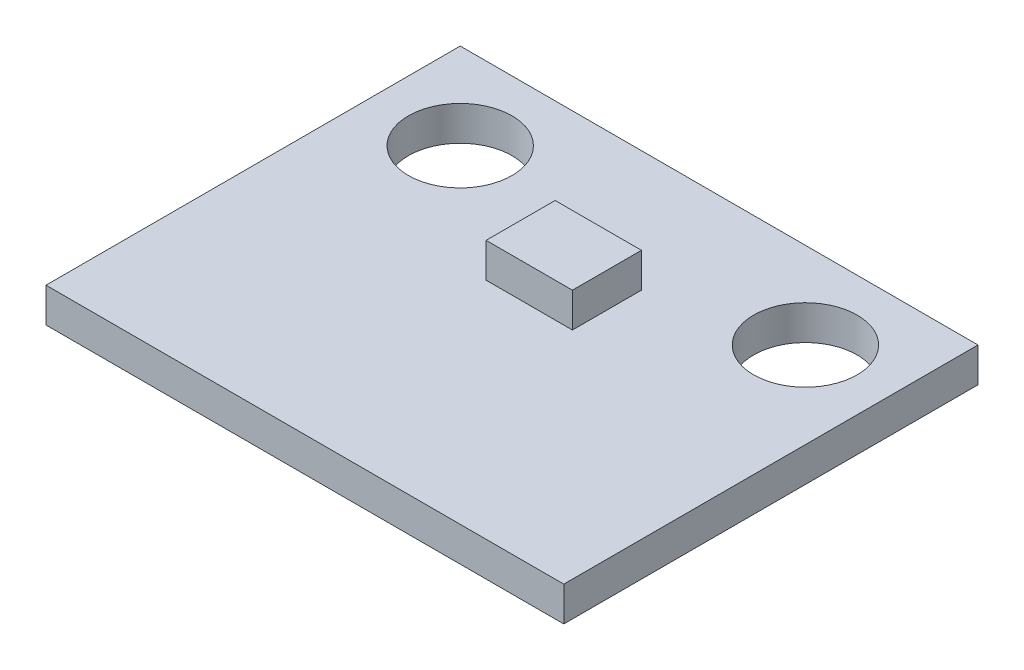
ISO-10303-21;
HEADER;
FILE_DESCRIPTION(('STEP AP214'),'2;1');
FILE_NAME('part.step','',(''),(''),'','','');
FILE_SCHEMA(('AUTOMOTIVE_DESIGN { 1 0 10303 214 1 1 1 1 }'));
ENDSEC;
DATA;
#1=APPLICATION_CONTEXT('core data for automotive mechanical design processes');
#2=APPLICATION_PROTOCOL_DEFINITION('international standard','automotive_design',2000,#1);
#3=PRODUCT_CONTEXT('',#1,'mechanical');
#4=PRODUCT('Part','Part','',(#3));
#5=PRODUCT_RELATED_PRODUCT_CATEGORY('part','',(#4));
#6=PRODUCT_DEFINITION_FORMATION('','',#4);
#7=PRODUCT_DEFINITION_CONTEXT('part definition',#1,'design');
#8=PRODUCT_DEFINITION('design','',#6,#7);
#9=PRODUCT_DEFINITION_SHAPE('','',#8);
#10=(LENGTH_UNIT() NAMED_UNIT(*) SI_UNIT(.MILLI.,.METRE.));
#11=(NAMED_UNIT(*) PLANE_ANGLE_UNIT() SI_UNIT($,.RADIAN.));
#12=(NAMED_UNIT(*) SI_UNIT($,.STERADIAN.) SOLID_ANGLE_UNIT());
#13=UNCERTAINTY_MEASURE_WITH_UNIT(LENGTH_MEASURE(1.E-05),#10,'distance_accuracy_value','');
#14=(GEOMETRIC_REPRESENTATION_CONTEXT(3) GLOBAL_UNCERTAINTY_ASSIGNED_CONTEXT((#13)) GLOBAL_UNIT_ASSIGNED_CONTEXT((#10,
#11,#12)) REPRESENTATION_CONTEXT('',''));
#15=CARTESIAN_POINT('',(0.,0.,0.));
#16=DIRECTION('',(0.,0.,1.));
#17=DIRECTION('',(1.,0.,0.));
#18=AXIS2_PLACEMENT_3D('',#15,#16,#17);
#19=CARTESIAN_POINT('',(0.,1.,0.));
#20=DIRECTION('',(0.,1.,0.));
#21=DIRECTION('',(0.,0.,1.));
#22=AXIS2_PLACEMENT_3D('',#19,#20,#21);
#23=PLANE('',#22);
#24=CARTESIAN_POINT('',(-5.,1.,-3.5));
#25=DIRECTION('',(0.,1.,0.));
#26=DIRECTION('',(0.,0.,1.));
#27=AXIS2_PLACEMENT_3D('',#24,#25,#26);
#28=CIRCLE('',#27,1.5);
#29=CARTESIAN_POINT('',(-5.,1.,-2.));
#30=VERTEX_POINT('',#29);
#31=EDGE_CURVE('E143',#30,#30,#28,.T.);
#32=ORIENTED_EDGE('',*,*,#31,.F.);
#33=EDGE_LOOP('',(#32));
#34=FACE_BOUND('',#33,.T.);
#35=DIRECTION('',(0.,0.,-1.));
#36=VECTOR('',#35,1.);
#37=CARTESIAN_POINT('',(7.5,1.,-6.));
#38=LINE('',#37,#36);
#39=CARTESIAN_POINT('',(7.5,1.,6.));
#40=VERTEX_POINT('',#39);
#41=CARTESIAN_POINT('',(7.5,1.,-6.));
#42=VERTEX_POINT('',#41);
#43=EDGE_CURVE('E149',#40,#42,#38,.T.);
#44=ORIENTED_EDGE('',*,*,#43,.T.);
#45=DIRECTION('',(-1.,0.,0.));
#46=VECTOR('',#45,1.);
#47=CARTESIAN_POINT('',(-7.5,1.,-6.));
#48=LINE('',#47,#46);
#49=CARTESIAN_POINT('',(-7.5,1.,-6.));
#50=VERTEX_POINT('',#49);
#51=EDGE_CURVE('E85',#42,#50,#48,.T.);
#52=ORIENTED_EDGE('',*,*,#51,.T.);
#53=DIRECTION('',(0.,0.,1.));
#54=VECTOR('',#53,1.);
#55=CARTESIAN_POINT('',(-7.5,1.,-6.));
#56=LINE('',#55,#54);
#57=CARTESIAN_POINT('',(-7.5,1.,6.));
#58=VERTEX_POINT('',#57);
#59=EDGE_CURVE('E152',#50,#58,#56,.T.);
#60=ORIENTED_EDGE('',*,*,#59,.T.);
#61=DIRECTION('',(1.,0.,0.));
#62=VECTOR('',#61,1.);
#63=CARTESIAN_POINT('',(-7.5,1.,6.));
#64=LINE('',#63,#62);
#65=EDGE_CURVE('E57',#58,#40,#64,.T.);
#66=ORIENTED_EDGE('',*,*,#65,.T.);
#67=EDGE_LOOP('',(#44,#52,#60,#66));
#68=FACE_BOUND('',#67,.T.);
#69=CARTESIAN_POINT('',(5.,1.,-3.5));
#70=DIRECTION('',(0.,1.,0.));
#71=DIRECTION('',(0.,0.,1.));
#72=AXIS2_PLACEMENT_3D('',#69,#70,#71);
#73=CIRCLE('',#72,1.5);
#74=CARTESIAN_POINT('',(5.,1.,-2.));
#75=VERTEX_POINT('',#74);
#76=EDGE_CURVE('E135',#75,#75,#73,.T.);
#77=ORIENTED_EDGE('',*,*,#76,.F.);
#78=EDGE_LOOP('',(#77));
#79=FACE_BOUND('',#78,.T.);
#80=DIRECTION('',(-1.,0.,0.));
#81=VECTOR('',#80,1.);
#82=CARTESIAN_POINT('',(-1.25,1.,-2.5));
#83=LINE('',#82,#81);
#84=CARTESIAN_POINT('',(1.25,1.,-2.5));
#85=VERTEX_POINT('',#84);
#86=CARTESIAN_POINT('',(-1.25,1.,-2.5));
#87=VERTEX_POINT('',#86);
#88=EDGE_CURVE('E298',#85,#87,#83,.T.);
#89=ORIENTED_EDGE('',*,*,#88,.F.);
#90=DIRECTION('',(0.,0.,-1.));
#91=VECTOR('',#90,1.);
#92=CARTESIAN_POINT('',(1.25,1.,-2.5));
#93=LINE('',#92,#91);
#94=CARTESIAN_POINT('',(1.25,1.,-0.5));
#95=VERTEX_POINT('',#94);
#96=EDGE_CURVE('E130',#95,#85,#93,.T.);
#97=ORIENTED_EDGE('',*,*,#96,.F.);
#98=DIRECTION('',(1.,0.,0.));
#99=VECTOR('',#98,1.);
#100=CARTESIAN_POINT('',(-1.25,1.,-0.5));
#101=LINE('',#100,#99);
#102=CARTESIAN_POINT('',(-1.25,1.,-0.5));
#103=VERTEX_POINT('',#102);
#104=EDGE_CURVE('E126',#103,#95,#101,.T.);
#105=ORIENTED_EDGE('',*,*,#104,.F.);
#106=DIRECTION('',(0.,0.,1.));
#107=VECTOR('',#106,1.);
#108=CARTESIAN_POINT('',(-1.25,1.,-2.5));
#109=LINE('',#108,#107);
#110=EDGE_CURVE('E295',#87,#103,#109,.T.);
#111=ORIENTED_EDGE('',*,*,#110,.F.);
#112=EDGE_LOOP('',(#89,#97,#105,#111));
#113=FACE_BOUND('',#112,.T.);
#114=ADVANCED_FACE('F33',(#34,#68,#79,#113),#23,.T.);
#115=CARTESIAN_POINT('',(0.,0.,0.));
#116=DIRECTION('',(0.,1.,0.));
#117=DIRECTION('',(0.,0.,1.));
#118=AXIS2_PLACEMENT_3D('',#115,#116,#117);
#119=PLANE('',#118);
#120=DIRECTION('',(0.,0.,-1.));
#121=VECTOR('',#120,1.);
#122=CARTESIAN_POINT('',(7.5,0.,-6.));
#123=LINE('',#122,#121);
#124=CARTESIAN_POINT('',(7.5,0.,6.));
#125=VERTEX_POINT('',#124);
#126=CARTESIAN_POINT('',(7.5,0.,-6.));
#127=VERTEX_POINT('',#126);
#128=EDGE_CURVE('E146',#125,#127,#123,.T.);
#129=ORIENTED_EDGE('',*,*,#128,.F.);
#130=DIRECTION('',(1.,0.,0.));
#131=VECTOR('',#130,1.);
#132=CARTESIAN_POINT('',(-7.5,0.,6.));
#133=LINE('',#132,#131);
#134=CARTESIAN_POINT('',(-7.5,0.,6.));
#135=VERTEX_POINT('',#134);
#136=EDGE_CURVE('E78',#135,#125,#133,.T.);
#137=ORIENTED_EDGE('',*,*,#136,.F.);
#138=DIRECTION('',(0.,0.,1.));
#139=VECTOR('',#138,1.);
#140=CARTESIAN_POINT('',(-7.5,0.,-6.));
#141=LINE('',#140,#139);
#142=CARTESIAN_POINT('',(-7.5,0.,-6.));
#143=VERTEX_POINT('',#142);
#144=EDGE_CURVE('E160',#143,#135,#141,.T.);
#145=ORIENTED_EDGE('',*,*,#144,.F.);
#146=DIRECTION('',(-1.,0.,0.));
#147=VECTOR('',#146,1.);
#148=CARTESIAN_POINT('',(-7.5,0.,-6.));
#149=LINE('',#148,#147);
#150=EDGE_CURVE('E158',#127,#143,#149,.T.);
#151=ORIENTED_EDGE('',*,*,#150,.F.);
#152=EDGE_LOOP('',(#129,#137,#145,#151));
#153=FACE_BOUND('',#152,.T.);
#154=CARTESIAN_POINT('',(-5.,0.,-3.5));
#155=DIRECTION('',(0.,1.,0.));
#156=DIRECTION('',(0.,0.,1.));
#157=AXIS2_PLACEMENT_3D('',#154,#155,#156);
#158=CIRCLE('',#157,1.5);
#159=CARTESIAN_POINT('',(-5.,0.,-2.));
#160=VERTEX_POINT('',#159);
#161=EDGE_CURVE('E141',#160,#160,#158,.T.);
#162=ORIENTED_EDGE('',*,*,#161,.T.);
#163=EDGE_LOOP('',(#162));
#164=FACE_BOUND('',#163,.T.);
#165=CARTESIAN_POINT('',(5.,0.,-3.5));
#166=DIRECTION('',(0.,1.,0.));
#167=DIRECTION('',(0.,0.,1.));
#168=AXIS2_PLACEMENT_3D('',#165,#166,#167);
#169=CIRCLE('',#168,1.5);
#170=CARTESIAN_POINT('',(5.,0.,-2.));
#171=VERTEX_POINT('',#170);
#172=EDGE_CURVE('E132',#171,#171,#169,.T.);
#173=ORIENTED_EDGE('',*,*,#172,.T.);
#174=EDGE_LOOP('',(#173));
#175=FACE_BOUND('',#174,.T.);
#176=ADVANCED_FACE('F173',(#153,#164,#175),#119,.F.);
#177=CARTESIAN_POINT('',(7.5,1.,-6.));
#178=DIRECTION('',(-1.,0.,0.));
#179=DIRECTION('',(0.,0.,1.));
#180=AXIS2_PLACEMENT_3D('',#177,#178,#179);
#181=PLANE('',#180);
#182=ORIENTED_EDGE('',*,*,#128,.T.);
#183=DIRECTION('',(0.,-1.,0.));
#184=VECTOR('',#183,1.);
#185=CARTESIAN_POINT('',(7.5,1.,-6.));
#186=LINE('',#185,#184);
#187=EDGE_CURVE('E11',#42,#127,#186,.T.);
#188=ORIENTED_EDGE('',*,*,#187,.F.);
#189=ORIENTED_EDGE('',*,*,#43,.F.);
#190=DIRECTION('',(0.,-1.,0.));
#191=VECTOR('',#190,1.);
#192=CARTESIAN_POINT('',(7.5,1.,6.));
#193=LINE('',#192,#191);
#194=EDGE_CURVE('E155',#40,#125,#193,.T.);
#195=ORIENTED_EDGE('',*,*,#194,.T.);
#196=EDGE_LOOP('',(#182,#188,#189,#195));
#197=FACE_BOUND('',#196,.T.);
#198=ADVANCED_FACE('F35',(#197),#181,.F.);
#199=CARTESIAN_POINT('',(-7.5,1.,-6.));
#200=DIRECTION('',(0.,0.,1.));
#201=DIRECTION('',(1.,0.,0.));
#202=AXIS2_PLACEMENT_3D('',#199,#200,#201);
#203=PLANE('',#202);
#204=ORIENTED_EDGE('',*,*,#150,.T.);
#205=DIRECTION('',(0.,-1.,0.));
#206=VECTOR('',#205,1.);
#207=CARTESIAN_POINT('',(-7.5,1.,-6.));
#208=LINE('',#207,#206);
#209=EDGE_CURVE('E41',#50,#143,#208,.T.);
#210=ORIENTED_EDGE('',*,*,#209,.F.);
#211=ORIENTED_EDGE('',*,*,#51,.F.);
#212=ORIENTED_EDGE('',*,*,#187,.T.);
#213=EDGE_LOOP('',(#204,#210,#211,#212));
#214=FACE_BOUND('',#213,.T.);
#215=ADVANCED_FACE('F189',(#214),#203,.F.);
#216=CARTESIAN_POINT('',(-7.5,1.,-6.));
#217=DIRECTION('',(1.,0.,0.));
#218=DIRECTION('',(0.,0.,-1.));
#219=AXIS2_PLACEMENT_3D('',#216,#217,#218);
#220=PLANE('',#219);
#221=ORIENTED_EDGE('',*,*,#144,.T.);
#222=DIRECTION('',(0.,-1.,0.));
#223=VECTOR('',#222,1.);
#224=CARTESIAN_POINT('',(-7.5,1.,6.));
#225=LINE('',#224,#223);
#226=EDGE_CURVE('E164',#58,#135,#225,.T.);
#227=ORIENTED_EDGE('',*,*,#226,.F.);
#228=ORIENTED_EDGE('',*,*,#59,.F.);
#229=ORIENTED_EDGE('',*,*,#209,.T.);
#230=EDGE_LOOP('',(#221,#227,#228,#229));
#231=FACE_BOUND('',#230,.T.);
#232=ADVANCED_FACE('F169',(#231),#220,.F.);
#233=CARTESIAN_POINT('',(-7.5,1.,6.));
#234=DIRECTION('',(0.,0.,-1.));
#235=DIRECTION('',(-1.,0.,0.));
#236=AXIS2_PLACEMENT_3D('',#233,#234,#235);
#237=PLANE('',#236);
#238=ORIENTED_EDGE('',*,*,#136,.T.);
#239=ORIENTED_EDGE('',*,*,#194,.F.);
#240=ORIENTED_EDGE('',*,*,#65,.F.);
#241=ORIENTED_EDGE('',*,*,#226,.T.);
#242=EDGE_LOOP('',(#238,#239,#240,#241));
#243=FACE_BOUND('',#242,.T.);
#244=ADVANCED_FACE('F178',(#243),#237,.F.);
#245=CARTESIAN_POINT('',(-5.,1.,-3.5));
#246=DIRECTION('',(0.,-1.,0.));
#247=DIRECTION('',(0.,0.,-1.));
#248=AXIS2_PLACEMENT_3D('',#245,#246,#247);
#249=CYLINDRICAL_SURFACE('',#248,1.5);
#250=ORIENTED_EDGE('',*,*,#31,.T.);
#251=EDGE_LOOP('',(#250));
#252=FACE_BOUND('',#251,.T.);
#253=ORIENTED_EDGE('',*,*,#161,.F.);
#254=EDGE_LOOP('',(#253));
#255=FACE_BOUND('',#254,.T.);
#256=ADVANCED_FACE('F180',(#252,#255),#249,.F.);
#257=CARTESIAN_POINT('',(5.,1.,-3.5));
#258=DIRECTION('',(0.,-1.,0.));
#259=DIRECTION('',(0.,0.,-1.));
#260=AXIS2_PLACEMENT_3D('',#257,#258,#259);
#261=CYLINDRICAL_SURFACE('',#260,1.5);
#262=ORIENTED_EDGE('',*,*,#76,.T.);
#263=EDGE_LOOP('',(#262));
#264=FACE_BOUND('',#263,.T.);
#265=ORIENTED_EDGE('',*,*,#172,.F.);
#266=EDGE_LOOP('',(#265));
#267=FACE_BOUND('',#266,.T.);
#268=ADVANCED_FACE('F186',(#264,#267),#261,.F.);
#269=CARTESIAN_POINT('',(1.25,2.,-2.5));
#270=DIRECTION('',(-1.,0.,0.));
#271=DIRECTION('',(0.,0.,1.));
#272=AXIS2_PLACEMENT_3D('',#269,#270,#271);
#273=PLANE('',#272);
#274=ORIENTED_EDGE('',*,*,#96,.T.);
#275=DIRECTION('',(0.,-1.,0.));
#276=VECTOR('',#275,1.);
#277=CARTESIAN_POINT('',(1.25,2.,-2.5));
#278=LINE('',#277,#276);
#279=CARTESIAN_POINT('',(1.25,2.,-2.5));
#280=VERTEX_POINT('',#279);
#281=EDGE_CURVE('E111',#280,#85,#278,.T.);
#282=ORIENTED_EDGE('',*,*,#281,.F.);
#283=DIRECTION('',(0.,0.,-1.));
#284=VECTOR('',#283,1.);
#285=CARTESIAN_POINT('',(1.25,2.,-2.5));
#286=LINE('',#285,#284);
#287=CARTESIAN_POINT('',(1.25,2.,-0.5));
#288=VERTEX_POINT('',#287);
#289=EDGE_CURVE('E118',#288,#280,#286,.T.);
#290=ORIENTED_EDGE('',*,*,#289,.F.);
#291=DIRECTION('',(0.,-1.,0.));
#292=VECTOR('',#291,1.);
#293=CARTESIAN_POINT('',(1.25,2.,-0.5));
#294=LINE('',#293,#292);
#295=EDGE_CURVE('E292',#288,#95,#294,.T.);
#296=ORIENTED_EDGE('',*,*,#295,.T.);
#297=EDGE_LOOP('',(#274,#282,#290,#296));
#298=FACE_BOUND('',#297,.T.);
#299=ADVANCED_FACE('F128',(#298),#273,.F.);
#300=CARTESIAN_POINT('',(-1.25,2.,-2.5));
#301=DIRECTION('',(0.,0.,1.));
#302=DIRECTION('',(1.,0.,0.));
#303=AXIS2_PLACEMENT_3D('',#300,#301,#302);
#304=PLANE('',#303);
#305=ORIENTED_EDGE('',*,*,#88,.T.);
#306=DIRECTION('',(0.,-1.,0.));
#307=VECTOR('',#306,1.);
#308=CARTESIAN_POINT('',(-1.25,2.,-2.5));
#309=LINE('',#308,#307);
#310=CARTESIAN_POINT('',(-1.25,2.,-2.5));
#311=VERTEX_POINT('',#310);
#312=EDGE_CURVE('E114',#311,#87,#309,.T.);
#313=ORIENTED_EDGE('',*,*,#312,.F.);
#314=DIRECTION('',(-1.,0.,0.));
#315=VECTOR('',#314,1.);
#316=CARTESIAN_POINT('',(-1.25,2.,-2.5));
#317=LINE('',#316,#315);
#318=EDGE_CURVE('E107',#280,#311,#317,.T.);
#319=ORIENTED_EDGE('',*,*,#318,.F.);
#320=ORIENTED_EDGE('',*,*,#281,.T.);
#321=EDGE_LOOP('',(#305,#313,#319,#320));
#322=FACE_BOUND('',#321,.T.);
#323=ADVANCED_FACE('F109',(#322),#304,.F.);
#324=CARTESIAN_POINT('',(-1.25,2.,-2.5));
#325=DIRECTION('',(1.,0.,0.));
#326=DIRECTION('',(0.,0.,-1.));
#327=AXIS2_PLACEMENT_3D('',#324,#325,#326);
#328=PLANE('',#327);
#329=ORIENTED_EDGE('',*,*,#110,.T.);
#330=DIRECTION('',(0.,-1.,0.));
#331=VECTOR('',#330,1.);
#332=CARTESIAN_POINT('',(-1.25,2.,-0.5));
#333=LINE('',#332,#331);
#334=CARTESIAN_POINT('',(-1.25,2.,-0.5));
#335=VERTEX_POINT('',#334);
#336=EDGE_CURVE('E48',#335,#103,#333,.T.);
#337=ORIENTED_EDGE('',*,*,#336,.F.);
#338=DIRECTION('',(0.,0.,1.));
#339=VECTOR('',#338,1.);
#340=CARTESIAN_POINT('',(-1.25,2.,-2.5));
#341=LINE('',#340,#339);
#342=EDGE_CURVE('E117',#311,#335,#341,.T.);
#343=ORIENTED_EDGE('',*,*,#342,.F.);
#344=ORIENTED_EDGE('',*,*,#312,.T.);
#345=EDGE_LOOP('',(#329,#337,#343,#344));
#346=FACE_BOUND('',#345,.T.);
#347=ADVANCED_FACE('F207',(#346),#328,.F.);
#348=CARTESIAN_POINT('',(-1.25,2.,-0.5));
#349=DIRECTION('',(0.,0.,-1.));
#350=DIRECTION('',(-1.,0.,0.));
#351=AXIS2_PLACEMENT_3D('',#348,#349,#350);
#352=PLANE('',#351);
#353=ORIENTED_EDGE('',*,*,#104,.T.);
#354=ORIENTED_EDGE('',*,*,#295,.F.);
#355=DIRECTION('',(1.,0.,0.));
#356=VECTOR('',#355,1.);
#357=CARTESIAN_POINT('',(-1.25,2.,-0.5));
#358=LINE('',#357,#356);
#359=EDGE_CURVE('E122',#335,#288,#358,.T.);
#360=ORIENTED_EDGE('',*,*,#359,.F.);
#361=ORIENTED_EDGE('',*,*,#336,.T.);
#362=EDGE_LOOP('',(#353,#354,#360,#361));
#363=FACE_BOUND('',#362,.T.);
#364=ADVANCED_FACE('F210',(#363),#352,.F.);
#365=CARTESIAN_POINT('',(0.,2.,0.));
#366=DIRECTION('',(0.,1.,0.));
#367=DIRECTION('',(0.,0.,1.));
#368=AXIS2_PLACEMENT_3D('',#365,#366,#367);
#369=PLANE('',#368);
#370=ORIENTED_EDGE('',*,*,#289,.T.);
#371=ORIENTED_EDGE('',*,*,#318,.T.);
#372=ORIENTED_EDGE('',*,*,#342,.T.);
#373=ORIENTED_EDGE('',*,*,#359,.T.);
#374=EDGE_LOOP('',(#370,#371,#372,#373));
#375=FACE_BOUND('',#374,.T.);
#376=ADVANCED_FACE('F121',(#375),#369,.T.);
#377=CLOSED_SHELL('',(#114,#176,#198,#215,#232,#244,#256,#268,#299,#323,#347,#364,#376));
#378=MANIFOLD_SOLID_BREP('B2',#377);
#379=ADVANCED_BREP_SHAPE_REPRESENTATION('',(#18,#378),#14);
#380=SHAPE_DEFINITION_REPRESENTATION(#9,#379);
ENDSEC;
END-ISO-10303-21;
